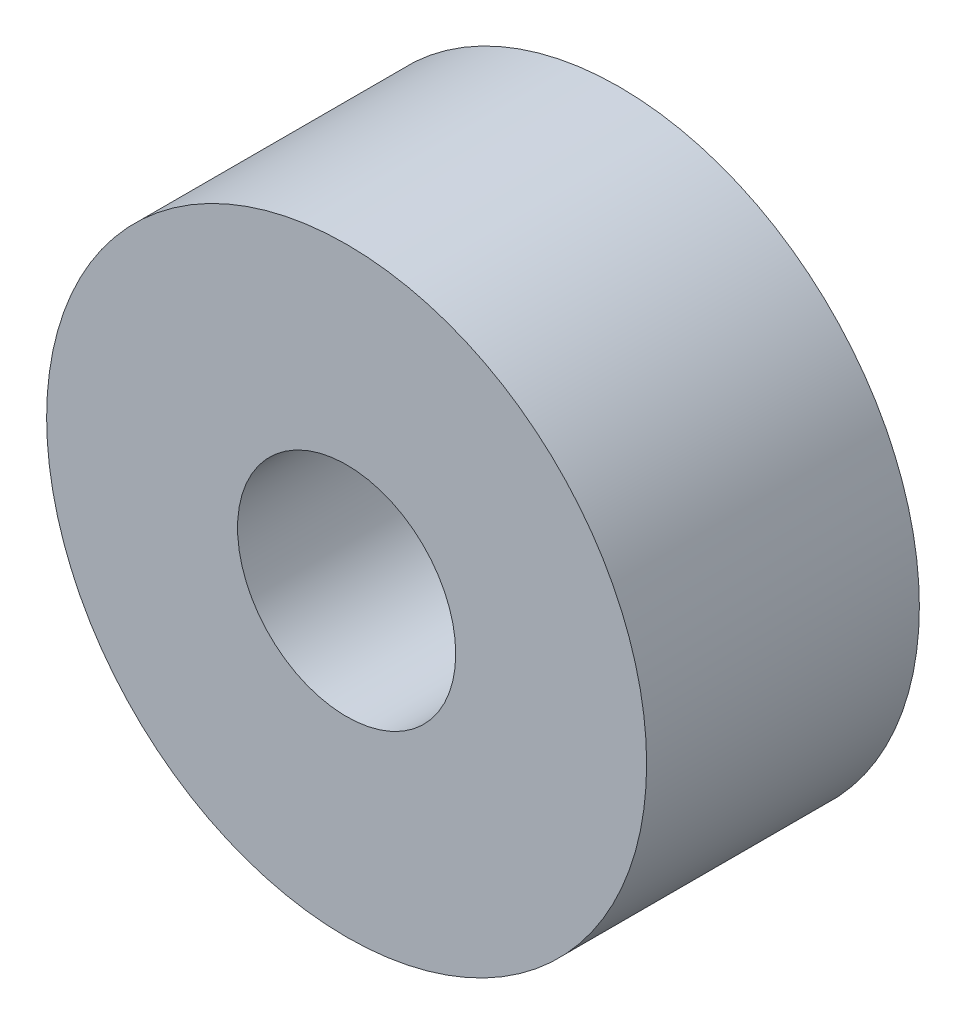
ISO-10303-21;
HEADER;
FILE_DESCRIPTION(('STEP AP214'),'2;1');
FILE_NAME('part.step','',(''),(''),'','','');
FILE_SCHEMA(('AUTOMOTIVE_DESIGN { 1 0 10303 214 1 1 1 1 }'));
ENDSEC;
DATA;
#1=APPLICATION_CONTEXT('core data for automotive mechanical design processes');
#2=APPLICATION_PROTOCOL_DEFINITION('international standard','automotive_design',2000,#1);
#3=PRODUCT_CONTEXT('',#1,'mechanical');
#4=PRODUCT('Part','Part','',(#3));
#5=PRODUCT_RELATED_PRODUCT_CATEGORY('part','',(#4));
#6=PRODUCT_DEFINITION_FORMATION('','',#4);
#7=PRODUCT_DEFINITION_CONTEXT('part definition',#1,'design');
#8=PRODUCT_DEFINITION('design','',#6,#7);
#9=PRODUCT_DEFINITION_SHAPE('','',#8);
#10=(LENGTH_UNIT() NAMED_UNIT(*) SI_UNIT(.MILLI.,.METRE.));
#11=(NAMED_UNIT(*) PLANE_ANGLE_UNIT() SI_UNIT($,.RADIAN.));
#12=(NAMED_UNIT(*) SI_UNIT($,.STERADIAN.) SOLID_ANGLE_UNIT());
#13=UNCERTAINTY_MEASURE_WITH_UNIT(LENGTH_MEASURE(1.E-05),#10,'distance_accuracy_value','');
#14=(GEOMETRIC_REPRESENTATION_CONTEXT(3) GLOBAL_UNCERTAINTY_ASSIGNED_CONTEXT((#13)) GLOBAL_UNIT_ASSIGNED_CONTEXT((#10,
#11,#12)) REPRESENTATION_CONTEXT('',''));
#15=CARTESIAN_POINT('',(0.,0.,0.));
#16=DIRECTION('',(0.,0.,1.));
#17=DIRECTION('',(1.,0.,0.));
#18=AXIS2_PLACEMENT_3D('',#15,#16,#17);
#19=CARTESIAN_POINT('',(0.,0.,10.));
#20=DIRECTION('',(0.,0.,1.));
#21=DIRECTION('',(1.,0.,0.));
#22=AXIS2_PLACEMENT_3D('',#19,#20,#21);
#23=PLANE('',#22);
#24=CARTESIAN_POINT('',(0.,0.,10.));
#25=DIRECTION('',(0.,0.,1.));
#26=DIRECTION('',(1.,0.,0.));
#27=AXIS2_PLACEMENT_3D('',#24,#25,#26);
#28=CIRCLE('',#27,11.);
#29=CARTESIAN_POINT('',(11.,0.,10.));
#30=VERTEX_POINT('',#29);
#31=EDGE_CURVE('E10',#30,#30,#28,.T.);
#32=ORIENTED_EDGE('',*,*,#31,.T.);
#33=EDGE_LOOP('',(#32));
#34=FACE_BOUND('',#33,.T.);
#35=CARTESIAN_POINT('',(0.,0.,10.));
#36=DIRECTION('',(0.,0.,1.));
#37=DIRECTION('',(1.,0.,0.));
#38=AXIS2_PLACEMENT_3D('',#35,#36,#37);
#39=CIRCLE('',#38,4.);
#40=CARTESIAN_POINT('',(4.,0.,10.));
#41=VERTEX_POINT('',#40);
#42=EDGE_CURVE('E50',#41,#41,#39,.T.);
#43=ORIENTED_EDGE('',*,*,#42,.F.);
#44=EDGE_LOOP('',(#43));
#45=FACE_BOUND('',#44,.T.);
#46=ADVANCED_FACE('F37',(#34,#45),#23,.T.);
#47=CARTESIAN_POINT('',(0.,0.,0.));
#48=DIRECTION('',(0.,0.,1.));
#49=DIRECTION('',(1.,0.,0.));
#50=AXIS2_PLACEMENT_3D('',#47,#48,#49);
#51=PLANE('',#50);
#52=CARTESIAN_POINT('',(0.,0.,0.));
#53=DIRECTION('',(0.,0.,1.));
#54=DIRECTION('',(1.,0.,0.));
#55=AXIS2_PLACEMENT_3D('',#52,#53,#54);
#56=CIRCLE('',#55,11.);
#57=CARTESIAN_POINT('',(11.,0.,0.));
#58=VERTEX_POINT('',#57);
#59=EDGE_CURVE('E41',#58,#58,#56,.T.);
#60=ORIENTED_EDGE('',*,*,#59,.F.);
#61=EDGE_LOOP('',(#60));
#62=FACE_BOUND('',#61,.T.);
#63=CARTESIAN_POINT('',(0.,0.,0.));
#64=DIRECTION('',(0.,0.,1.));
#65=DIRECTION('',(1.,0.,0.));
#66=AXIS2_PLACEMENT_3D('',#63,#64,#65);
#67=CIRCLE('',#66,4.);
#68=CARTESIAN_POINT('',(4.,0.,0.));
#69=VERTEX_POINT('',#68);
#70=EDGE_CURVE('E52',#69,#69,#67,.T.);
#71=ORIENTED_EDGE('',*,*,#70,.T.);
#72=EDGE_LOOP('',(#71));
#73=FACE_BOUND('',#72,.T.);
#74=ADVANCED_FACE('F64',(#62,#73),#51,.F.);
#75=CARTESIAN_POINT('',(0.,0.,10.));
#76=DIRECTION('',(0.,0.,-1.));
#77=DIRECTION('',(-1.,0.,0.));
#78=AXIS2_PLACEMENT_3D('',#75,#76,#77);
#79=CYLINDRICAL_SURFACE('',#78,11.);
#80=ORIENTED_EDGE('',*,*,#31,.F.);
#81=EDGE_LOOP('',(#80));
#82=FACE_BOUND('',#81,.T.);
#83=ORIENTED_EDGE('',*,*,#59,.T.);
#84=EDGE_LOOP('',(#83));
#85=FACE_BOUND('',#84,.T.);
#86=ADVANCED_FACE('F39',(#82,#85),#79,.T.);
#87=CARTESIAN_POINT('',(0.,0.,10.));
#88=DIRECTION('',(0.,0.,-1.));
#89=DIRECTION('',(-1.,0.,0.));
#90=AXIS2_PLACEMENT_3D('',#87,#88,#89);
#91=CYLINDRICAL_SURFACE('',#90,4.);
#92=ORIENTED_EDGE('',*,*,#42,.T.);
#93=EDGE_LOOP('',(#92));
#94=FACE_BOUND('',#93,.T.);
#95=ORIENTED_EDGE('',*,*,#70,.F.);
#96=EDGE_LOOP('',(#95));
#97=FACE_BOUND('',#96,.T.);
#98=ADVANCED_FACE('F60',(#94,#97),#91,.F.);
#99=CLOSED_SHELL('',(#46,#74,#86,#98));
#100=MANIFOLD_SOLID_BREP('B2',#99);
#101=ADVANCED_BREP_SHAPE_REPRESENTATION('',(#18,#100),#14);
#102=SHAPE_DEFINITION_REPRESENTATION(#9,#101);
ENDSEC;
END-ISO-10303-21;
